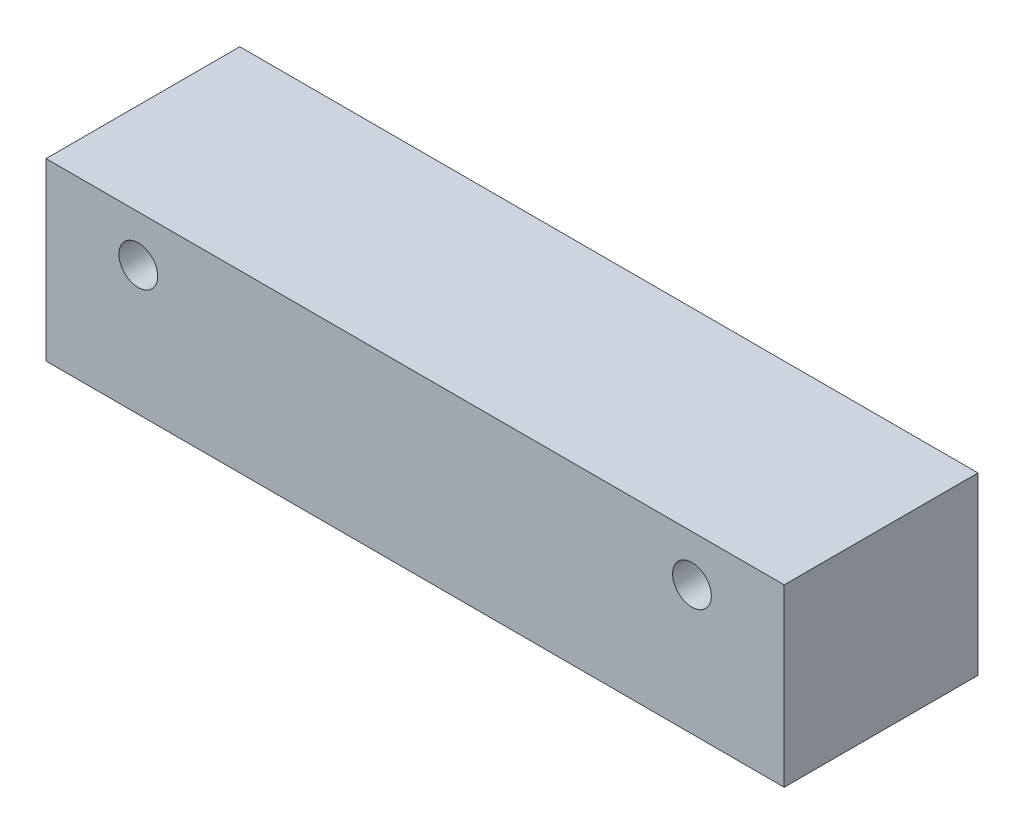
ISO-10303-21;
HEADER;
FILE_DESCRIPTION(('STEP AP214'),'2;1');
FILE_NAME('part.step','',(''),(''),'','','');
FILE_SCHEMA(('AUTOMOTIVE_DESIGN { 1 0 10303 214 1 1 1 1 }'));
ENDSEC;
DATA;
#1=APPLICATION_CONTEXT('core data for automotive mechanical design processes');
#2=APPLICATION_PROTOCOL_DEFINITION('international standard','automotive_design',2000,#1);
#3=PRODUCT_CONTEXT('',#1,'mechanical');
#4=PRODUCT('Part','Part','',(#3));
#5=PRODUCT_RELATED_PRODUCT_CATEGORY('part','',(#4));
#6=PRODUCT_DEFINITION_FORMATION('','',#4);
#7=PRODUCT_DEFINITION_CONTEXT('part definition',#1,'design');
#8=PRODUCT_DEFINITION('design','',#6,#7);
#9=PRODUCT_DEFINITION_SHAPE('','',#8);
#10=(LENGTH_UNIT() NAMED_UNIT(*) SI_UNIT(.MILLI.,.METRE.));
#11=(NAMED_UNIT(*) PLANE_ANGLE_UNIT() SI_UNIT($,.RADIAN.));
#12=(NAMED_UNIT(*) SI_UNIT($,.STERADIAN.) SOLID_ANGLE_UNIT());
#13=UNCERTAINTY_MEASURE_WITH_UNIT(LENGTH_MEASURE(1.E-05),#10,'distance_accuracy_value','');
#14=(GEOMETRIC_REPRESENTATION_CONTEXT(3) GLOBAL_UNCERTAINTY_ASSIGNED_CONTEXT((#13)) GLOBAL_UNIT_ASSIGNED_CONTEXT((#10,
#11,#12)) REPRESENTATION_CONTEXT('',''));
#15=CARTESIAN_POINT('',(0.,0.,0.));
#16=DIRECTION('',(0.,0.,1.));
#17=DIRECTION('',(1.,0.,0.));
#18=AXIS2_PLACEMENT_3D('',#15,#16,#17);
#19=CARTESIAN_POINT('',(0.,0.,10.5));
#20=DIRECTION('',(1.,0.,0.));
#21=DIRECTION('',(0.,0.,-1.));
#22=AXIS2_PLACEMENT_3D('',#19,#20,#21);
#23=PLANE('',#22);
#24=DIRECTION('',(0.,-1.,0.));
#25=VECTOR('',#24,1.);
#26=CARTESIAN_POINT('',(0.,0.,-10.5));
#27=LINE('',#26,#25);
#28=CARTESIAN_POINT('',(0.,19.,-10.5));
#29=VERTEX_POINT('',#28);
#30=CARTESIAN_POINT('',(0.,0.,-10.5));
#31=VERTEX_POINT('',#30);
#32=EDGE_CURVE('E104',#29,#31,#27,.T.);
#33=ORIENTED_EDGE('',*,*,#32,.T.);
#34=DIRECTION('',(0.,0.,-1.));
#35=VECTOR('',#34,1.);
#36=CARTESIAN_POINT('',(0.,0.,10.5));
#37=LINE('',#36,#35);
#38=CARTESIAN_POINT('',(0.,0.,10.5));
#39=VERTEX_POINT('',#38);
#40=EDGE_CURVE('E11',#39,#31,#37,.T.);
#41=ORIENTED_EDGE('',*,*,#40,.F.);
#42=DIRECTION('',(0.,-1.,0.));
#43=VECTOR('',#42,1.);
#44=CARTESIAN_POINT('',(0.,0.,10.5));
#45=LINE('',#44,#43);
#46=CARTESIAN_POINT('',(0.,19.,10.5));
#47=VERTEX_POINT('',#46);
#48=EDGE_CURVE('E92',#47,#39,#45,.T.);
#49=ORIENTED_EDGE('',*,*,#48,.F.);
#50=DIRECTION('',(0.,0.,-1.));
#51=VECTOR('',#50,1.);
#52=CARTESIAN_POINT('',(0.,19.,10.5));
#53=LINE('',#52,#51);
#54=EDGE_CURVE('E100',#47,#29,#53,.T.);
#55=ORIENTED_EDGE('',*,*,#54,.T.);
#56=EDGE_LOOP('',(#33,#41,#49,#55));
#57=FACE_BOUND('',#56,.T.);
#58=ADVANCED_FACE('F41',(#57),#23,.F.);
#59=CARTESIAN_POINT('',(0.,0.,10.5));
#60=DIRECTION('',(0.,1.,0.));
#61=DIRECTION('',(0.,0.,1.));
#62=AXIS2_PLACEMENT_3D('',#59,#60,#61);
#63=PLANE('',#62);
#64=DIRECTION('',(1.,0.,0.));
#65=VECTOR('',#64,1.);
#66=CARTESIAN_POINT('',(0.,0.,-10.5));
#67=LINE('',#66,#65);
#68=CARTESIAN_POINT('',(80.,0.,-10.5));
#69=VERTEX_POINT('',#68);
#70=EDGE_CURVE('E96',#31,#69,#67,.T.);
#71=ORIENTED_EDGE('',*,*,#70,.T.);
#72=DIRECTION('',(0.,0.,-1.));
#73=VECTOR('',#72,1.);
#74=CARTESIAN_POINT('',(80.,0.,10.5));
#75=LINE('',#74,#73);
#76=CARTESIAN_POINT('',(80.,0.,10.5));
#77=VERTEX_POINT('',#76);
#78=EDGE_CURVE('E49',#77,#69,#75,.T.);
#79=ORIENTED_EDGE('',*,*,#78,.F.);
#80=DIRECTION('',(1.,0.,0.));
#81=VECTOR('',#80,1.);
#82=CARTESIAN_POINT('',(0.,0.,10.5));
#83=LINE('',#82,#81);
#84=EDGE_CURVE('E87',#39,#77,#83,.T.);
#85=ORIENTED_EDGE('',*,*,#84,.F.);
#86=ORIENTED_EDGE('',*,*,#40,.T.);
#87=EDGE_LOOP('',(#71,#79,#85,#86));
#88=FACE_BOUND('',#87,.T.);
#89=ADVANCED_FACE('F95',(#88),#63,.F.);
#90=CARTESIAN_POINT('',(80.,0.,10.5));
#91=DIRECTION('',(-1.,0.,0.));
#92=DIRECTION('',(0.,0.,1.));
#93=AXIS2_PLACEMENT_3D('',#90,#91,#92);
#94=PLANE('',#93);
#95=DIRECTION('',(0.,1.,0.));
#96=VECTOR('',#95,1.);
#97=CARTESIAN_POINT('',(80.,0.,-10.5));
#98=LINE('',#97,#96);
#99=CARTESIAN_POINT('',(80.,19.,-10.5));
#100=VERTEX_POINT('',#99);
#101=EDGE_CURVE('E74',#69,#100,#98,.T.);
#102=ORIENTED_EDGE('',*,*,#101,.T.);
#103=DIRECTION('',(0.,0.,-1.));
#104=VECTOR('',#103,1.);
#105=CARTESIAN_POINT('',(80.,19.,10.5));
#106=LINE('',#105,#104);
#107=CARTESIAN_POINT('',(80.,19.,10.5));
#108=VERTEX_POINT('',#107);
#109=EDGE_CURVE('E97',#108,#100,#106,.T.);
#110=ORIENTED_EDGE('',*,*,#109,.F.);
#111=DIRECTION('',(0.,1.,0.));
#112=VECTOR('',#111,1.);
#113=CARTESIAN_POINT('',(80.,0.,10.5));
#114=LINE('',#113,#112);
#115=EDGE_CURVE('E90',#77,#108,#114,.T.);
#116=ORIENTED_EDGE('',*,*,#115,.F.);
#117=ORIENTED_EDGE('',*,*,#78,.T.);
#118=EDGE_LOOP('',(#102,#110,#116,#117));
#119=FACE_BOUND('',#118,.T.);
#120=ADVANCED_FACE('F98',(#119),#94,.F.);
#121=CARTESIAN_POINT('',(0.,19.,10.5));
#122=DIRECTION('',(0.,-1.,0.));
#123=DIRECTION('',(0.,0.,-1.));
#124=AXIS2_PLACEMENT_3D('',#121,#122,#123);
#125=PLANE('',#124);
#126=DIRECTION('',(-1.,0.,0.));
#127=VECTOR('',#126,1.);
#128=CARTESIAN_POINT('',(0.,19.,-10.5));
#129=LINE('',#128,#127);
#130=EDGE_CURVE('E80',#100,#29,#129,.T.);
#131=ORIENTED_EDGE('',*,*,#130,.T.);
#132=ORIENTED_EDGE('',*,*,#54,.F.);
#133=DIRECTION('',(-1.,0.,0.));
#134=VECTOR('',#133,1.);
#135=CARTESIAN_POINT('',(0.,19.,10.5));
#136=LINE('',#135,#134);
#137=EDGE_CURVE('E57',#108,#47,#136,.T.);
#138=ORIENTED_EDGE('',*,*,#137,.F.);
#139=ORIENTED_EDGE('',*,*,#109,.T.);
#140=EDGE_LOOP('',(#131,#132,#138,#139));
#141=FACE_BOUND('',#140,.T.);
#142=ADVANCED_FACE('F112',(#141),#125,.F.);
#143=CARTESIAN_POINT('',(0.,0.,10.5));
#144=DIRECTION('',(0.,0.,-1.));
#145=DIRECTION('',(-1.,0.,0.));
#146=AXIS2_PLACEMENT_3D('',#143,#144,#145);
#147=PLANE('',#146);
#148=CARTESIAN_POINT('',(10.,14.,10.5));
#149=DIRECTION('',(0.,0.,1.));
#150=DIRECTION('',(1.,0.,0.));
#151=AXIS2_PLACEMENT_3D('',#148,#149,#150);
#152=CIRCLE('',#151,2.1);
#153=CARTESIAN_POINT('',(12.1,14.,10.5));
#154=VERTEX_POINT('',#153);
#155=EDGE_CURVE('E126',#154,#154,#152,.T.);
#156=ORIENTED_EDGE('',*,*,#155,.F.);
#157=EDGE_LOOP('',(#156));
#158=FACE_BOUND('',#157,.T.);
#159=CARTESIAN_POINT('',(70.,14.,10.5));
#160=DIRECTION('',(0.,0.,1.));
#161=DIRECTION('',(1.,0.,0.));
#162=AXIS2_PLACEMENT_3D('',#159,#160,#161);
#163=CIRCLE('',#162,2.1);
#164=CARTESIAN_POINT('',(72.1,14.,10.5));
#165=VERTEX_POINT('',#164);
#166=EDGE_CURVE('E120',#165,#165,#163,.T.);
#167=ORIENTED_EDGE('',*,*,#166,.F.);
#168=EDGE_LOOP('',(#167));
#169=FACE_BOUND('',#168,.T.);
#170=ORIENTED_EDGE('',*,*,#48,.T.);
#171=ORIENTED_EDGE('',*,*,#84,.T.);
#172=ORIENTED_EDGE('',*,*,#115,.T.);
#173=ORIENTED_EDGE('',*,*,#137,.T.);
#174=EDGE_LOOP('',(#170,#171,#172,#173));
#175=FACE_BOUND('',#174,.T.);
#176=ADVANCED_FACE('F88',(#158,#169,#175),#147,.F.);
#177=CARTESIAN_POINT('',(0.,0.,-10.5));
#178=DIRECTION('',(0.,0.,-1.));
#179=DIRECTION('',(-1.,0.,0.));
#180=AXIS2_PLACEMENT_3D('',#177,#178,#179);
#181=PLANE('',#180);
#182=CARTESIAN_POINT('',(10.,14.,-10.5));
#183=DIRECTION('',(0.,0.,1.));
#184=DIRECTION('',(1.,0.,0.));
#185=AXIS2_PLACEMENT_3D('',#182,#183,#184);
#186=CIRCLE('',#185,2.1);
#187=CARTESIAN_POINT('',(12.1,14.,-10.5));
#188=VERTEX_POINT('',#187);
#189=EDGE_CURVE('E123',#188,#188,#186,.T.);
#190=ORIENTED_EDGE('',*,*,#189,.T.);
#191=EDGE_LOOP('',(#190));
#192=FACE_BOUND('',#191,.T.);
#193=CARTESIAN_POINT('',(70.,14.,-10.5));
#194=DIRECTION('',(0.,0.,1.));
#195=DIRECTION('',(1.,0.,0.));
#196=AXIS2_PLACEMENT_3D('',#193,#194,#195);
#197=CIRCLE('',#196,2.09999999999999);
#198=CARTESIAN_POINT('',(72.1,14.,-10.5));
#199=VERTEX_POINT('',#198);
#200=EDGE_CURVE('E107',#199,#199,#197,.T.);
#201=ORIENTED_EDGE('',*,*,#200,.T.);
#202=EDGE_LOOP('',(#201));
#203=FACE_BOUND('',#202,.T.);
#204=ORIENTED_EDGE('',*,*,#32,.F.);
#205=ORIENTED_EDGE('',*,*,#130,.F.);
#206=ORIENTED_EDGE('',*,*,#101,.F.);
#207=ORIENTED_EDGE('',*,*,#70,.F.);
#208=EDGE_LOOP('',(#204,#205,#206,#207));
#209=FACE_BOUND('',#208,.T.);
#210=ADVANCED_FACE('F115',(#192,#203,#209),#181,.T.);
#211=CARTESIAN_POINT('',(70.,14.,10.5));
#212=DIRECTION('',(0.,0.,1.));
#213=DIRECTION('',(1.,0.,0.));
#214=AXIS2_PLACEMENT_3D('',#211,#212,#213);
#215=CYLINDRICAL_SURFACE('',#214,2.1);
#216=ORIENTED_EDGE('',*,*,#200,.F.);
#217=EDGE_LOOP('',(#216));
#218=FACE_BOUND('',#217,.T.);
#219=ORIENTED_EDGE('',*,*,#166,.T.);
#220=EDGE_LOOP('',(#219));
#221=FACE_BOUND('',#220,.T.);
#222=ADVANCED_FACE('F137',(#218,#221),#215,.F.);
#223=CARTESIAN_POINT('',(10.,14.,10.5));
#224=DIRECTION('',(0.,0.,1.));
#225=DIRECTION('',(1.,0.,0.));
#226=AXIS2_PLACEMENT_3D('',#223,#224,#225);
#227=CYLINDRICAL_SURFACE('',#226,2.1);
#228=ORIENTED_EDGE('',*,*,#189,.F.);
#229=EDGE_LOOP('',(#228));
#230=FACE_BOUND('',#229,.T.);
#231=ORIENTED_EDGE('',*,*,#155,.T.);
#232=EDGE_LOOP('',(#231));
#233=FACE_BOUND('',#232,.T.);
#234=ADVANCED_FACE('F130',(#230,#233),#227,.F.);
#235=CLOSED_SHELL('',(#58,#89,#120,#142,#176,#210,#222,#234));
#236=MANIFOLD_SOLID_BREP('B2',#235);
#237=ADVANCED_BREP_SHAPE_REPRESENTATION('',(#18,#236),#14);
#238=SHAPE_DEFINITION_REPRESENTATION(#9,#237);
ENDSEC;
END-ISO-10303-21;
